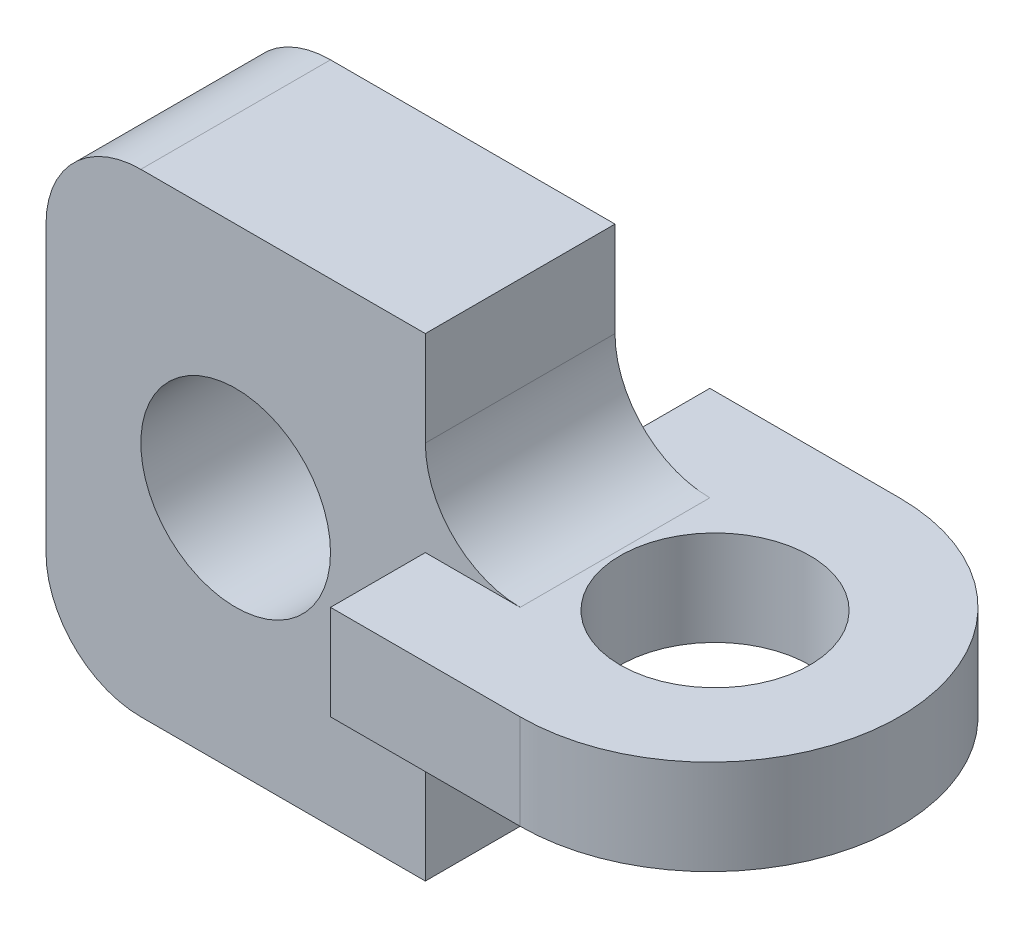
ISO-10303-21;
HEADER;
FILE_DESCRIPTION(('STEP AP214'),'2;1');
FILE_NAME('part.step','',(''),(''),'','','');
FILE_SCHEMA(('AUTOMOTIVE_DESIGN { 1 0 10303 214 1 1 1 1 }'));
ENDSEC;
DATA;
#1=APPLICATION_CONTEXT('core data for automotive mechanical design processes');
#2=APPLICATION_PROTOCOL_DEFINITION('international standard','automotive_design',2000,#1);
#3=PRODUCT_CONTEXT('',#1,'mechanical');
#4=PRODUCT('Part','Part','',(#3));
#5=PRODUCT_RELATED_PRODUCT_CATEGORY('part','',(#4));
#6=PRODUCT_DEFINITION_FORMATION('','',#4);
#7=PRODUCT_DEFINITION_CONTEXT('part definition',#1,'design');
#8=PRODUCT_DEFINITION('design','',#6,#7);
#9=PRODUCT_DEFINITION_SHAPE('','',#8);
#10=(LENGTH_UNIT() NAMED_UNIT(*) SI_UNIT(.MILLI.,.METRE.));
#11=(NAMED_UNIT(*) PLANE_ANGLE_UNIT() SI_UNIT($,.RADIAN.));
#12=(NAMED_UNIT(*) SI_UNIT($,.STERADIAN.) SOLID_ANGLE_UNIT());
#13=UNCERTAINTY_MEASURE_WITH_UNIT(LENGTH_MEASURE(1.E-05),#10,'distance_accuracy_value','');
#14=(GEOMETRIC_REPRESENTATION_CONTEXT(3) GLOBAL_UNCERTAINTY_ASSIGNED_CONTEXT((#13)) GLOBAL_UNIT_ASSIGNED_CONTEXT((#10,
#11,#12)) REPRESENTATION_CONTEXT('',''));
#15=CARTESIAN_POINT('',(0.,0.,0.));
#16=DIRECTION('',(0.,0.,1.));
#17=DIRECTION('',(1.,0.,0.));
#18=AXIS2_PLACEMENT_3D('',#15,#16,#17);
#19=CARTESIAN_POINT('',(-20.5488614832967,0.,0.));
#20=DIRECTION('',(1.,0.,0.));
#21=DIRECTION('',(0.,0.,-1.));
#22=AXIS2_PLACEMENT_3D('',#19,#20,#21);
#23=PLANE('',#22);
#24=DIRECTION('',(0.,-1.,0.));
#25=VECTOR('',#24,1.);
#26=CARTESIAN_POINT('',(-20.5488614832967,30.,9.99999999999999));
#27=LINE('',#26,#25);
#28=CARTESIAN_POINT('',(-20.5488614832967,30.,9.99999999999999));
#29=VERTEX_POINT('',#28);
#30=CARTESIAN_POINT('',(-20.5488614832967,20.0000000000001,10.));
#31=VERTEX_POINT('',#30);
#32=EDGE_CURVE('E167',#29,#31,#27,.T.);
#33=ORIENTED_EDGE('',*,*,#32,.T.);
#34=DIRECTION('',(0.,0.,1.));
#35=VECTOR('',#34,1.);
#36=CARTESIAN_POINT('',(-20.5488614832967,20.0000000000001,-10.));
#37=LINE('',#36,#35);
#38=CARTESIAN_POINT('',(-20.5488614832967,20.0000000000001,-10.));
#39=VERTEX_POINT('',#38);
#40=EDGE_CURVE('E194',#39,#31,#37,.T.);
#41=ORIENTED_EDGE('',*,*,#40,.F.);
#42=DIRECTION('',(0.,-1.,0.));
#43=VECTOR('',#42,1.);
#44=CARTESIAN_POINT('',(-20.5488614832967,30.,-10.));
#45=LINE('',#44,#43);
#46=CARTESIAN_POINT('',(-20.5488614832967,30.,-10.));
#47=VERTEX_POINT('',#46);
#48=EDGE_CURVE('E252',#47,#39,#45,.T.);
#49=ORIENTED_EDGE('',*,*,#48,.F.);
#50=DIRECTION('',(0.,0.,1.));
#51=VECTOR('',#50,1.);
#52=CARTESIAN_POINT('',(-20.5488614832967,30.,-10.));
#53=LINE('',#52,#51);
#54=EDGE_CURVE('E247',#47,#29,#53,.T.);
#55=ORIENTED_EDGE('',*,*,#54,.T.);
#56=EDGE_LOOP('',(#33,#41,#49,#55));
#57=FACE_BOUND('',#56,.T.);
#58=ADVANCED_FACE('F40',(#57),#23,.T.);
#59=CARTESIAN_POINT('',(-60.5488614832967,30.,-10.));
#60=DIRECTION('',(0.,1.,0.));
#61=DIRECTION('',(0.,0.,1.));
#62=AXIS2_PLACEMENT_3D('',#59,#60,#61);
#63=PLANE('',#62);
#64=DIRECTION('',(1.,0.,0.));
#65=VECTOR('',#64,1.);
#66=CARTESIAN_POINT('',(-60.5488614832967,30.,-10.));
#67=LINE('',#66,#65);
#68=CARTESIAN_POINT('',(-50.5488614832967,30.,-10.));
#69=VERTEX_POINT('',#68);
#70=EDGE_CURVE('E269',#69,#47,#67,.T.);
#71=ORIENTED_EDGE('',*,*,#70,.F.);
#72=DIRECTION('',(0.,0.,1.));
#73=VECTOR('',#72,1.);
#74=CARTESIAN_POINT('',(-50.5488614832967,30.,-30.));
#75=LINE('',#74,#73);
#76=CARTESIAN_POINT('',(-50.5488614832967,30.,10.));
#77=VERTEX_POINT('',#76);
#78=EDGE_CURVE('E226',#69,#77,#75,.T.);
#79=ORIENTED_EDGE('',*,*,#78,.T.);
#80=DIRECTION('',(1.,0.,0.));
#81=VECTOR('',#80,1.);
#82=CARTESIAN_POINT('',(-60.5488614832967,30.,9.99999999999999));
#83=LINE('',#82,#81);
#84=EDGE_CURVE('E256',#77,#29,#83,.T.);
#85=ORIENTED_EDGE('',*,*,#84,.T.);
#86=ORIENTED_EDGE('',*,*,#54,.F.);
#87=EDGE_LOOP('',(#71,#79,#85,#86));
#88=FACE_BOUND('',#87,.T.);
#89=ADVANCED_FACE('F391',(#88),#63,.T.);
#90=CARTESIAN_POINT('',(-60.5488614832967,30.,-10.));
#91=DIRECTION('',(0.,0.,1.));
#92=DIRECTION('',(0.,-1.,0.));
#93=AXIS2_PLACEMENT_3D('',#90,#91,#92);
#94=PLANE('',#93);
#95=CARTESIAN_POINT('',(-40.5488614832967,5.,-10.));
#96=DIRECTION('',(0.,0.,1.));
#97=DIRECTION('',(0.,-1.,0.));
#98=AXIS2_PLACEMENT_3D('',#95,#96,#97);
#99=CIRCLE('',#98,10.);
#100=CARTESIAN_POINT('',(-40.5488614832967,-5.,-10.));
#101=VERTEX_POINT('',#100);
#102=EDGE_CURVE('E243',#101,#101,#99,.T.);
#103=ORIENTED_EDGE('',*,*,#102,.T.);
#104=EDGE_LOOP('',(#103));
#105=FACE_BOUND('',#104,.T.);
#106=CARTESIAN_POINT('',(-50.5488614832967,-10.,-10.));
#107=DIRECTION('',(0.,0.,1.));
#108=DIRECTION('',(0.,-1.,0.));
#109=AXIS2_PLACEMENT_3D('',#106,#107,#108);
#110=CIRCLE('',#109,10.);
#111=CARTESIAN_POINT('',(-60.5488614832967,-9.99999999999993,-10.));
#112=VERTEX_POINT('',#111);
#113=CARTESIAN_POINT('',(-50.5488614832967,-20.,-10.));
#114=VERTEX_POINT('',#113);
#115=EDGE_CURVE('E240',#112,#114,#110,.T.);
#116=ORIENTED_EDGE('',*,*,#115,.F.);
#117=DIRECTION('',(0.,-1.,0.));
#118=VECTOR('',#117,1.);
#119=CARTESIAN_POINT('',(-60.5488614832967,30.,-10.));
#120=LINE('',#119,#118);
#121=CARTESIAN_POINT('',(-60.5488614832967,20.,-10.));
#122=VERTEX_POINT('',#121);
#123=EDGE_CURVE('E251',#122,#112,#120,.T.);
#124=ORIENTED_EDGE('',*,*,#123,.F.);
#125=CARTESIAN_POINT('',(-50.5488614832967,20.,-10.));
#126=DIRECTION('',(0.,0.,1.));
#127=DIRECTION('',(0.,-1.,0.));
#128=AXIS2_PLACEMENT_3D('',#125,#126,#127);
#129=CIRCLE('',#128,10.);
#130=EDGE_CURVE('E237',#69,#122,#129,.T.);
#131=ORIENTED_EDGE('',*,*,#130,.F.);
#132=ORIENTED_EDGE('',*,*,#70,.T.);
#133=ORIENTED_EDGE('',*,*,#48,.T.);
#134=CARTESIAN_POINT('',(-10.5488614832967,20.,-10.));
#135=DIRECTION('',(0.,0.,-1.));
#136=DIRECTION('',(-1.,0.,0.));
#137=AXIS2_PLACEMENT_3D('',#134,#135,#136);
#138=CIRCLE('',#137,10.);
#139=CARTESIAN_POINT('',(-10.5488614832967,10.,-10.));
#140=VERTEX_POINT('',#139);
#141=EDGE_CURVE('E182',#140,#39,#138,.T.);
#142=ORIENTED_EDGE('',*,*,#141,.F.);
#143=DIRECTION('',(1.,0.,0.));
#144=VECTOR('',#143,1.);
#145=CARTESIAN_POINT('',(-20.5488614832967,10.,-10.));
#146=LINE('',#145,#144);
#147=CARTESIAN_POINT('',(-20.5488614832967,10.,-10.));
#148=VERTEX_POINT('',#147);
#149=EDGE_CURVE('E56',#148,#140,#146,.T.);
#150=ORIENTED_EDGE('',*,*,#149,.F.);
#151=CARTESIAN_POINT('',(-20.5488614832967,0.,-10.));
#152=VERTEX_POINT('',#151);
#153=EDGE_CURVE('E165',#148,#152,#45,.T.);
#154=ORIENTED_EDGE('',*,*,#153,.T.);
#155=DIRECTION('',(-1.,0.,0.));
#156=VECTOR('',#155,1.);
#157=CARTESIAN_POINT('',(-20.5488614832967,0.,-10.));
#158=LINE('',#157,#156);
#159=CARTESIAN_POINT('',(-10.5488614832967,0.,-10.));
#160=VERTEX_POINT('',#159);
#161=EDGE_CURVE('E198',#160,#152,#158,.T.);
#162=ORIENTED_EDGE('',*,*,#161,.F.);
#163=CARTESIAN_POINT('',(-10.5488614832967,-10.,-10.));
#164=DIRECTION('',(0.,0.,-1.));
#165=DIRECTION('',(-1.,0.,0.));
#166=AXIS2_PLACEMENT_3D('',#163,#164,#165);
#167=CIRCLE('',#166,10.);
#168=CARTESIAN_POINT('',(-20.5488614832967,-10.0000000000001,-10.));
#169=VERTEX_POINT('',#168);
#170=EDGE_CURVE('E201',#169,#160,#167,.T.);
#171=ORIENTED_EDGE('',*,*,#170,.F.);
#172=CARTESIAN_POINT('',(-20.5488614832967,-20.,-10.));
#173=VERTEX_POINT('',#172);
#174=EDGE_CURVE('E265',#169,#173,#45,.T.);
#175=ORIENTED_EDGE('',*,*,#174,.T.);
#176=DIRECTION('',(1.,0.,0.));
#177=VECTOR('',#176,1.);
#178=CARTESIAN_POINT('',(-60.5488614832967,-20.,-10.));
#179=LINE('',#178,#177);
#180=EDGE_CURVE('E273',#114,#173,#179,.T.);
#181=ORIENTED_EDGE('',*,*,#180,.F.);
#182=EDGE_LOOP('',(#116,#124,#131,#132,#133,#142,#150,#154,#162,#171,#175,#181));
#183=FACE_BOUND('',#182,.T.);
#184=ADVANCED_FACE('F343',(#105,#183),#94,.F.);
#185=CARTESIAN_POINT('',(-60.5488614832967,-20.,-10.));
#186=DIRECTION('',(0.,1.,0.));
#187=DIRECTION('',(0.,0.,1.));
#188=AXIS2_PLACEMENT_3D('',#185,#186,#187);
#189=PLANE('',#188);
#190=DIRECTION('',(0.,0.,1.));
#191=VECTOR('',#190,1.);
#192=CARTESIAN_POINT('',(-50.5488614832967,-20.,-30.));
#193=LINE('',#192,#191);
#194=CARTESIAN_POINT('',(-50.5488614832967,-20.,10.));
#195=VERTEX_POINT('',#194);
#196=EDGE_CURVE('E227',#114,#195,#193,.T.);
#197=ORIENTED_EDGE('',*,*,#196,.F.);
#198=ORIENTED_EDGE('',*,*,#180,.T.);
#199=DIRECTION('',(0.,0.,1.));
#200=VECTOR('',#199,1.);
#201=CARTESIAN_POINT('',(-20.5488614832967,-20.,-10.));
#202=LINE('',#201,#200);
#203=CARTESIAN_POINT('',(-20.5488614832967,-20.,10.));
#204=VERTEX_POINT('',#203);
#205=EDGE_CURVE('E261',#173,#204,#202,.T.);
#206=ORIENTED_EDGE('',*,*,#205,.T.);
#207=DIRECTION('',(1.,0.,0.));
#208=VECTOR('',#207,1.);
#209=CARTESIAN_POINT('',(-60.5488614832967,-20.,10.));
#210=LINE('',#209,#208);
#211=EDGE_CURVE('E277',#195,#204,#210,.T.);
#212=ORIENTED_EDGE('',*,*,#211,.F.);
#213=EDGE_LOOP('',(#197,#198,#206,#212));
#214=FACE_BOUND('',#213,.T.);
#215=ADVANCED_FACE('F347',(#214),#189,.F.);
#216=CARTESIAN_POINT('',(-60.5488614832967,30.,9.99999999999999));
#217=DIRECTION('',(0.,0.,1.));
#218=DIRECTION('',(0.,-1.,0.));
#219=AXIS2_PLACEMENT_3D('',#216,#217,#218);
#220=PLANE('',#219);
#221=CARTESIAN_POINT('',(-40.5488614832967,5.,10.));
#222=DIRECTION('',(0.,0.,1.));
#223=DIRECTION('',(1.,0.,0.));
#224=AXIS2_PLACEMENT_3D('',#221,#222,#223);
#225=CIRCLE('',#224,10.);
#226=CARTESIAN_POINT('',(-30.5488614832967,5.,10.));
#227=VERTEX_POINT('',#226);
#228=EDGE_CURVE('E230',#227,#227,#225,.T.);
#229=ORIENTED_EDGE('',*,*,#228,.F.);
#230=EDGE_LOOP('',(#229));
#231=FACE_BOUND('',#230,.T.);
#232=DIRECTION('',(0.,-1.,0.));
#233=VECTOR('',#232,1.);
#234=CARTESIAN_POINT('',(-60.5488614832967,30.,9.99999999999999));
#235=LINE('',#234,#233);
#236=CARTESIAN_POINT('',(-60.5488614832967,19.9999999999999,10.));
#237=VERTEX_POINT('',#236);
#238=CARTESIAN_POINT('',(-60.5488614832967,-10.,10.));
#239=VERTEX_POINT('',#238);
#240=EDGE_CURVE('E248',#237,#239,#235,.T.);
#241=ORIENTED_EDGE('',*,*,#240,.T.);
#242=CARTESIAN_POINT('',(-50.5488614832967,-10.,10.));
#243=DIRECTION('',(0.,0.,1.));
#244=DIRECTION('',(-1.,0.,0.));
#245=AXIS2_PLACEMENT_3D('',#242,#243,#244);
#246=CIRCLE('',#245,10.);
#247=EDGE_CURVE('E222',#239,#195,#246,.T.);
#248=ORIENTED_EDGE('',*,*,#247,.T.);
#249=ORIENTED_EDGE('',*,*,#211,.T.);
#250=CARTESIAN_POINT('',(-20.5488614832967,-10.0000000000001,10.));
#251=VERTEX_POINT('',#250);
#252=EDGE_CURVE('E168',#251,#204,#27,.T.);
#253=ORIENTED_EDGE('',*,*,#252,.F.);
#254=CARTESIAN_POINT('',(-10.5488614832967,-10.,10.));
#255=DIRECTION('',(0.,0.,-1.));
#256=DIRECTION('',(-1.,0.,0.));
#257=AXIS2_PLACEMENT_3D('',#254,#255,#256);
#258=CIRCLE('',#257,10.);
#259=CARTESIAN_POINT('',(-10.5488614832967,0.,10.));
#260=VERTEX_POINT('',#259);
#261=EDGE_CURVE('E202',#251,#260,#258,.T.);
#262=ORIENTED_EDGE('',*,*,#261,.T.);
#263=DIRECTION('',(-1.,0.,0.));
#264=VECTOR('',#263,1.);
#265=CARTESIAN_POINT('',(-20.5488614832967,0.,10.));
#266=LINE('',#265,#264);
#267=CARTESIAN_POINT('',(-20.5488614832967,0.,10.));
#268=VERTEX_POINT('',#267);
#269=EDGE_CURVE('E161',#260,#268,#266,.T.);
#270=ORIENTED_EDGE('',*,*,#269,.T.);
#271=CARTESIAN_POINT('',(-20.5488614832967,10.,10.));
#272=VERTEX_POINT('',#271);
#273=EDGE_CURVE('E154',#272,#268,#27,.T.);
#274=ORIENTED_EDGE('',*,*,#273,.F.);
#275=DIRECTION('',(1.,0.,0.));
#276=VECTOR('',#275,1.);
#277=CARTESIAN_POINT('',(-20.5488614832967,10.,10.));
#278=LINE('',#277,#276);
#279=CARTESIAN_POINT('',(-10.5488614832967,10.,10.));
#280=VERTEX_POINT('',#279);
#281=EDGE_CURVE('E159',#272,#280,#278,.T.);
#282=ORIENTED_EDGE('',*,*,#281,.T.);
#283=CARTESIAN_POINT('',(-10.5488614832967,20.,10.));
#284=DIRECTION('',(0.,0.,-1.));
#285=DIRECTION('',(-1.,0.,0.));
#286=AXIS2_PLACEMENT_3D('',#283,#284,#285);
#287=CIRCLE('',#286,10.);
#288=EDGE_CURVE('E183',#280,#31,#287,.T.);
#289=ORIENTED_EDGE('',*,*,#288,.T.);
#290=ORIENTED_EDGE('',*,*,#32,.F.);
#291=ORIENTED_EDGE('',*,*,#84,.F.);
#292=CARTESIAN_POINT('',(-50.5488614832967,20.,10.));
#293=DIRECTION('',(0.,0.,1.));
#294=DIRECTION('',(-1.,0.,0.));
#295=AXIS2_PLACEMENT_3D('',#292,#293,#294);
#296=CIRCLE('',#295,10.);
#297=EDGE_CURVE('E215',#77,#237,#296,.T.);
#298=ORIENTED_EDGE('',*,*,#297,.T.);
#299=EDGE_LOOP('',(#241,#248,#249,#253,#262,#270,#274,#282,#289,#290,#291,#298));
#300=FACE_BOUND('',#299,.T.);
#301=ADVANCED_FACE('F157',(#231,#300),#220,.T.);
#302=CARTESIAN_POINT('',(-60.5488614832967,0.,0.));
#303=DIRECTION('',(1.,0.,0.));
#304=DIRECTION('',(0.,0.,-1.));
#305=AXIS2_PLACEMENT_3D('',#302,#303,#304);
#306=PLANE('',#305);
#307=ORIENTED_EDGE('',*,*,#123,.T.);
#308=DIRECTION('',(0.,0.,1.));
#309=VECTOR('',#308,1.);
#310=CARTESIAN_POINT('',(-60.5488614832967,-10.,-30.));
#311=LINE('',#310,#309);
#312=EDGE_CURVE('E12',#112,#239,#311,.T.);
#313=ORIENTED_EDGE('',*,*,#312,.T.);
#314=ORIENTED_EDGE('',*,*,#240,.F.);
#315=DIRECTION('',(0.,0.,1.));
#316=VECTOR('',#315,1.);
#317=CARTESIAN_POINT('',(-60.5488614832967,20.,-30.));
#318=LINE('',#317,#316);
#319=EDGE_CURVE('E49',#122,#237,#318,.T.);
#320=ORIENTED_EDGE('',*,*,#319,.F.);
#321=EDGE_LOOP('',(#307,#313,#314,#320));
#322=FACE_BOUND('',#321,.T.);
#323=ADVANCED_FACE('F336',(#322),#306,.F.);
#324=CARTESIAN_POINT('',(-20.5488614832967,10.,-20.));
#325=DIRECTION('',(1.,0.,0.));
#326=DIRECTION('',(0.,0.,-1.));
#327=AXIS2_PLACEMENT_3D('',#324,#325,#326);
#328=PLANE('',#327);
#329=ORIENTED_EDGE('',*,*,#153,.F.);
#330=DIRECTION('',(0.,0.,1.));
#331=VECTOR('',#330,1.);
#332=CARTESIAN_POINT('',(-20.5488614832967,10.,-20.));
#333=LINE('',#332,#331);
#334=CARTESIAN_POINT('',(-20.5488614832967,10.,-20.));
#335=VERTEX_POINT('',#334);
#336=EDGE_CURVE('E176',#335,#148,#333,.T.);
#337=ORIENTED_EDGE('',*,*,#336,.F.);
#338=DIRECTION('',(0.,-1.,0.));
#339=VECTOR('',#338,1.);
#340=CARTESIAN_POINT('',(-20.5488614832967,10.,-20.));
#341=LINE('',#340,#339);
#342=CARTESIAN_POINT('',(-20.5488614832967,0.,-20.));
#343=VERTEX_POINT('',#342);
#344=EDGE_CURVE('E319',#335,#343,#341,.T.);
#345=ORIENTED_EDGE('',*,*,#344,.T.);
#346=DIRECTION('',(0.,0.,1.));
#347=VECTOR('',#346,1.);
#348=CARTESIAN_POINT('',(-20.5488614832967,0.,-20.));
#349=LINE('',#348,#347);
#350=EDGE_CURVE('E308',#343,#152,#349,.T.);
#351=ORIENTED_EDGE('',*,*,#350,.T.);
#352=EDGE_LOOP('',(#329,#337,#345,#351));
#353=FACE_BOUND('',#352,.T.);
#354=ADVANCED_FACE('F363',(#353),#328,.F.);
#355=CARTESIAN_POINT('',(-0.548861483296744,10.,0.));
#356=DIRECTION('',(0.,1.,0.));
#357=DIRECTION('',(0.,0.,1.));
#358=AXIS2_PLACEMENT_3D('',#355,#356,#357);
#359=PLANE('',#358);
#360=ORIENTED_EDGE('',*,*,#149,.T.);
#361=DIRECTION('',(0.,0.,1.));
#362=VECTOR('',#361,1.);
#363=CARTESIAN_POINT('',(-10.5488614832967,10.,-10.));
#364=LINE('',#363,#362);
#365=EDGE_CURVE('E60',#140,#280,#364,.T.);
#366=ORIENTED_EDGE('',*,*,#365,.T.);
#367=ORIENTED_EDGE('',*,*,#281,.F.);
#368=CARTESIAN_POINT('',(-20.5488614832967,10.,20.));
#369=VERTEX_POINT('',#368);
#370=EDGE_CURVE('E170',#272,#369,#333,.T.);
#371=ORIENTED_EDGE('',*,*,#370,.T.);
#372=DIRECTION('',(1.,0.,0.));
#373=VECTOR('',#372,1.);
#374=CARTESIAN_POINT('',(-20.5488614832967,10.,20.));
#375=LINE('',#374,#373);
#376=CARTESIAN_POINT('',(-0.548861483296744,10.,20.));
#377=VERTEX_POINT('',#376);
#378=EDGE_CURVE('E298',#369,#377,#375,.T.);
#379=ORIENTED_EDGE('',*,*,#378,.T.);
#380=CARTESIAN_POINT('',(-0.548861483296744,10.,0.));
#381=DIRECTION('',(0.,1.,0.));
#382=DIRECTION('',(0.,0.,1.));
#383=AXIS2_PLACEMENT_3D('',#380,#381,#382);
#384=CIRCLE('',#383,20.);
#385=CARTESIAN_POINT('',(-0.548861483296744,10.,-20.));
#386=VERTEX_POINT('',#385);
#387=EDGE_CURVE('E291',#377,#386,#384,.T.);
#388=ORIENTED_EDGE('',*,*,#387,.T.);
#389=DIRECTION('',(-1.,0.,0.));
#390=VECTOR('',#389,1.);
#391=CARTESIAN_POINT('',(-0.548861483296744,10.,-20.));
#392=LINE('',#391,#390);
#393=EDGE_CURVE('E177',#386,#335,#392,.T.);
#394=ORIENTED_EDGE('',*,*,#393,.T.);
#395=ORIENTED_EDGE('',*,*,#336,.T.);
#396=EDGE_LOOP('',(#360,#366,#367,#371,#379,#388,#394,#395));
#397=FACE_BOUND('',#396,.T.);
#398=CARTESIAN_POINT('',(0.,10.,0.));
#399=DIRECTION('',(0.,1.,0.));
#400=DIRECTION('',(0.,0.,1.));
#401=AXIS2_PLACEMENT_3D('',#398,#399,#400);
#402=CIRCLE('',#401,10.);
#403=CARTESIAN_POINT('',(0.,10.,10.));
#404=VERTEX_POINT('',#403);
#405=EDGE_CURVE('E283',#404,#404,#402,.T.);
#406=ORIENTED_EDGE('',*,*,#405,.F.);
#407=EDGE_LOOP('',(#406));
#408=FACE_BOUND('',#407,.T.);
#409=ADVANCED_FACE('F179',(#397,#408),#359,.T.);
#410=CARTESIAN_POINT('',(-0.548861483296744,0.,0.));
#411=DIRECTION('',(0.,1.,0.));
#412=DIRECTION('',(0.,0.,1.));
#413=AXIS2_PLACEMENT_3D('',#410,#411,#412);
#414=PLANE('',#413);
#415=CARTESIAN_POINT('',(0.,0.,0.));
#416=DIRECTION('',(0.,1.,0.));
#417=DIRECTION('',(0.,0.,1.));
#418=AXIS2_PLACEMENT_3D('',#415,#416,#417);
#419=CIRCLE('',#418,10.);
#420=CARTESIAN_POINT('',(0.,0.,10.));
#421=VERTEX_POINT('',#420);
#422=EDGE_CURVE('E272',#421,#421,#419,.T.);
#423=ORIENTED_EDGE('',*,*,#422,.T.);
#424=EDGE_LOOP('',(#423));
#425=FACE_BOUND('',#424,.T.);
#426=DIRECTION('',(0.,0.,1.));
#427=VECTOR('',#426,1.);
#428=CARTESIAN_POINT('',(-10.5488614832967,0.,-10.));
#429=LINE('',#428,#427);
#430=EDGE_CURVE('E211',#160,#260,#429,.T.);
#431=ORIENTED_EDGE('',*,*,#430,.F.);
#432=ORIENTED_EDGE('',*,*,#161,.T.);
#433=ORIENTED_EDGE('',*,*,#350,.F.);
#434=DIRECTION('',(-1.,0.,0.));
#435=VECTOR('',#434,1.);
#436=CARTESIAN_POINT('',(-0.548861483296744,0.,-20.));
#437=LINE('',#436,#435);
#438=CARTESIAN_POINT('',(-0.548861483296744,0.,-20.));
#439=VERTEX_POINT('',#438);
#440=EDGE_CURVE('E304',#439,#343,#437,.T.);
#441=ORIENTED_EDGE('',*,*,#440,.F.);
#442=CARTESIAN_POINT('',(-0.548861483296744,0.,0.));
#443=DIRECTION('',(0.,1.,0.));
#444=DIRECTION('',(0.,0.,1.));
#445=AXIS2_PLACEMENT_3D('',#442,#443,#444);
#446=CIRCLE('',#445,20.);
#447=CARTESIAN_POINT('',(-0.548861483296744,0.,20.));
#448=VERTEX_POINT('',#447);
#449=EDGE_CURVE('E287',#448,#439,#446,.T.);
#450=ORIENTED_EDGE('',*,*,#449,.F.);
#451=DIRECTION('',(1.,0.,0.));
#452=VECTOR('',#451,1.);
#453=CARTESIAN_POINT('',(-20.5488614832967,0.,20.));
#454=LINE('',#453,#452);
#455=CARTESIAN_POINT('',(-20.5488614832967,0.,20.));
#456=VERTEX_POINT('',#455);
#457=EDGE_CURVE('E294',#456,#448,#454,.T.);
#458=ORIENTED_EDGE('',*,*,#457,.F.);
#459=EDGE_CURVE('E307',#268,#456,#349,.T.);
#460=ORIENTED_EDGE('',*,*,#459,.F.);
#461=ORIENTED_EDGE('',*,*,#269,.F.);
#462=EDGE_LOOP('',(#431,#432,#433,#441,#450,#458,#460,#461));
#463=FACE_BOUND('',#462,.T.);
#464=ADVANCED_FACE('F373',(#425,#463),#414,.F.);
#465=CARTESIAN_POINT('',(-0.548861483296744,10.,0.));
#466=DIRECTION('',(0.,-1.,0.));
#467=DIRECTION('',(0.,0.,-1.));
#468=AXIS2_PLACEMENT_3D('',#465,#466,#467);
#469=CYLINDRICAL_SURFACE('',#468,20.);
#470=DIRECTION('',(0.,-1.,0.));
#471=VECTOR('',#470,1.);
#472=CARTESIAN_POINT('',(-0.548861483296744,10.,-20.));
#473=LINE('',#472,#471);
#474=EDGE_CURVE('E323',#386,#439,#473,.T.);
#475=ORIENTED_EDGE('',*,*,#474,.F.);
#476=ORIENTED_EDGE('',*,*,#387,.F.);
#477=DIRECTION('',(0.,-1.,0.));
#478=VECTOR('',#477,1.);
#479=CARTESIAN_POINT('',(-0.548861483296744,10.,20.));
#480=LINE('',#479,#478);
#481=EDGE_CURVE('E301',#377,#448,#480,.T.);
#482=ORIENTED_EDGE('',*,*,#481,.T.);
#483=ORIENTED_EDGE('',*,*,#449,.T.);
#484=EDGE_LOOP('',(#475,#476,#482,#483));
#485=FACE_BOUND('',#484,.T.);
#486=ADVANCED_FACE('F42',(#485),#469,.T.);
#487=CARTESIAN_POINT('',(-0.548861483296744,10.,-20.));
#488=DIRECTION('',(0.,0.,1.));
#489=DIRECTION('',(1.,0.,0.));
#490=AXIS2_PLACEMENT_3D('',#487,#488,#489);
#491=PLANE('',#490);
#492=ORIENTED_EDGE('',*,*,#440,.T.);
#493=ORIENTED_EDGE('',*,*,#344,.F.);
#494=ORIENTED_EDGE('',*,*,#393,.F.);
#495=ORIENTED_EDGE('',*,*,#474,.T.);
#496=EDGE_LOOP('',(#492,#493,#494,#495));
#497=FACE_BOUND('',#496,.T.);
#498=ADVANCED_FACE('F370',(#497),#491,.F.);
#499=ORIENTED_EDGE('',*,*,#370,.F.);
#500=ORIENTED_EDGE('',*,*,#273,.T.);
#501=ORIENTED_EDGE('',*,*,#459,.T.);
#502=DIRECTION('',(0.,-1.,0.));
#503=VECTOR('',#502,1.);
#504=CARTESIAN_POINT('',(-20.5488614832967,10.,20.));
#505=LINE('',#504,#503);
#506=EDGE_CURVE('E173',#369,#456,#505,.T.);
#507=ORIENTED_EDGE('',*,*,#506,.F.);
#508=EDGE_LOOP('',(#499,#500,#501,#507));
#509=FACE_BOUND('',#508,.T.);
#510=ADVANCED_FACE('F171',(#509),#328,.F.);
#511=CARTESIAN_POINT('',(-20.5488614832967,10.,20.));
#512=DIRECTION('',(0.,0.,-1.));
#513=DIRECTION('',(-1.,0.,0.));
#514=AXIS2_PLACEMENT_3D('',#511,#512,#513);
#515=PLANE('',#514);
#516=ORIENTED_EDGE('',*,*,#457,.T.);
#517=ORIENTED_EDGE('',*,*,#481,.F.);
#518=ORIENTED_EDGE('',*,*,#378,.F.);
#519=ORIENTED_EDGE('',*,*,#506,.T.);
#520=EDGE_LOOP('',(#516,#517,#518,#519));
#521=FACE_BOUND('',#520,.T.);
#522=ADVANCED_FACE('F408',(#521),#515,.F.);
#523=CARTESIAN_POINT('',(0.,10.,0.));
#524=DIRECTION('',(0.,-1.,0.));
#525=DIRECTION('',(0.,0.,-1.));
#526=AXIS2_PLACEMENT_3D('',#523,#524,#525);
#527=CYLINDRICAL_SURFACE('',#526,10.);
#528=ORIENTED_EDGE('',*,*,#405,.T.);
#529=EDGE_LOOP('',(#528));
#530=FACE_BOUND('',#529,.T.);
#531=ORIENTED_EDGE('',*,*,#422,.F.);
#532=EDGE_LOOP('',(#531));
#533=FACE_BOUND('',#532,.T.);
#534=ADVANCED_FACE('F402',(#530,#533),#527,.F.);
#535=DIRECTION('',(0.,0.,1.));
#536=VECTOR('',#535,1.);
#537=CARTESIAN_POINT('',(-20.5488614832967,-10.0000000000001,-10.));
#538=LINE('',#537,#536);
#539=EDGE_CURVE('E206',#169,#251,#538,.T.);
#540=ORIENTED_EDGE('',*,*,#539,.T.);
#541=ORIENTED_EDGE('',*,*,#252,.T.);
#542=ORIENTED_EDGE('',*,*,#205,.F.);
#543=ORIENTED_EDGE('',*,*,#174,.F.);
#544=EDGE_LOOP('',(#540,#541,#542,#543));
#545=FACE_BOUND('',#544,.T.);
#546=ADVANCED_FACE('F350',(#545),#23,.T.);
#547=CARTESIAN_POINT('',(-50.5488614832967,20.,-30.));
#548=DIRECTION('',(0.,0.,1.));
#549=DIRECTION('',(1.,0.,0.));
#550=AXIS2_PLACEMENT_3D('',#547,#548,#549);
#551=CYLINDRICAL_SURFACE('',#550,10.);
#552=ORIENTED_EDGE('',*,*,#130,.T.);
#553=ORIENTED_EDGE('',*,*,#319,.T.);
#554=ORIENTED_EDGE('',*,*,#297,.F.);
#555=ORIENTED_EDGE('',*,*,#78,.F.);
#556=EDGE_LOOP('',(#552,#553,#554,#555));
#557=FACE_BOUND('',#556,.T.);
#558=ADVANCED_FACE('F329',(#557),#551,.T.);
#559=CARTESIAN_POINT('',(-50.5488614832967,-10.,-30.));
#560=DIRECTION('',(0.,0.,1.));
#561=DIRECTION('',(1.,0.,0.));
#562=AXIS2_PLACEMENT_3D('',#559,#560,#561);
#563=CYLINDRICAL_SURFACE('',#562,10.);
#564=ORIENTED_EDGE('',*,*,#115,.T.);
#565=ORIENTED_EDGE('',*,*,#196,.T.);
#566=ORIENTED_EDGE('',*,*,#247,.F.);
#567=ORIENTED_EDGE('',*,*,#312,.F.);
#568=EDGE_LOOP('',(#564,#565,#566,#567));
#569=FACE_BOUND('',#568,.T.);
#570=ADVANCED_FACE('F339',(#569),#563,.T.);
#571=CARTESIAN_POINT('',(-40.5488614832967,5.,-30.));
#572=DIRECTION('',(0.,0.,1.));
#573=DIRECTION('',(1.,0.,0.));
#574=AXIS2_PLACEMENT_3D('',#571,#572,#573);
#575=CYLINDRICAL_SURFACE('',#574,10.);
#576=ORIENTED_EDGE('',*,*,#228,.T.);
#577=EDGE_LOOP('',(#576));
#578=FACE_BOUND('',#577,.T.);
#579=ORIENTED_EDGE('',*,*,#102,.F.);
#580=EDGE_LOOP('',(#579));
#581=FACE_BOUND('',#580,.T.);
#582=ADVANCED_FACE('F379',(#578,#581),#575,.F.);
#583=CARTESIAN_POINT('',(-10.5488614832967,-10.,-10.));
#584=DIRECTION('',(0.,0.,1.));
#585=DIRECTION('',(1.,0.,0.));
#586=AXIS2_PLACEMENT_3D('',#583,#584,#585);
#587=CYLINDRICAL_SURFACE('',#586,10.);
#588=ORIENTED_EDGE('',*,*,#261,.F.);
#589=ORIENTED_EDGE('',*,*,#539,.F.);
#590=ORIENTED_EDGE('',*,*,#170,.T.);
#591=ORIENTED_EDGE('',*,*,#430,.T.);
#592=EDGE_LOOP('',(#588,#589,#590,#591));
#593=FACE_BOUND('',#592,.T.);
#594=ADVANCED_FACE('F376',(#593),#587,.F.);
#595=CARTESIAN_POINT('',(-10.5488614832967,20.,-10.));
#596=DIRECTION('',(0.,0.,1.));
#597=DIRECTION('',(1.,0.,0.));
#598=AXIS2_PLACEMENT_3D('',#595,#596,#597);
#599=CYLINDRICAL_SURFACE('',#598,10.);
#600=ORIENTED_EDGE('',*,*,#288,.F.);
#601=ORIENTED_EDGE('',*,*,#365,.F.);
#602=ORIENTED_EDGE('',*,*,#141,.T.);
#603=ORIENTED_EDGE('',*,*,#40,.T.);
#604=EDGE_LOOP('',(#600,#601,#602,#603));
#605=FACE_BOUND('',#604,.T.);
#606=ADVANCED_FACE('F378',(#605),#599,.F.);
#607=CLOSED_SHELL('',(#58,#89,#184,#215,#301,#323,#354,#409,#464,#486,#498,#510,#522,#534,#546,
#558,#570,#582,#594,#606));
#608=MANIFOLD_SOLID_BREP('B2',#607);
#609=ADVANCED_BREP_SHAPE_REPRESENTATION('',(#18,#608),#14);
#610=SHAPE_DEFINITION_REPRESENTATION(#9,#609);
ENDSEC;
END-ISO-10303-21;
